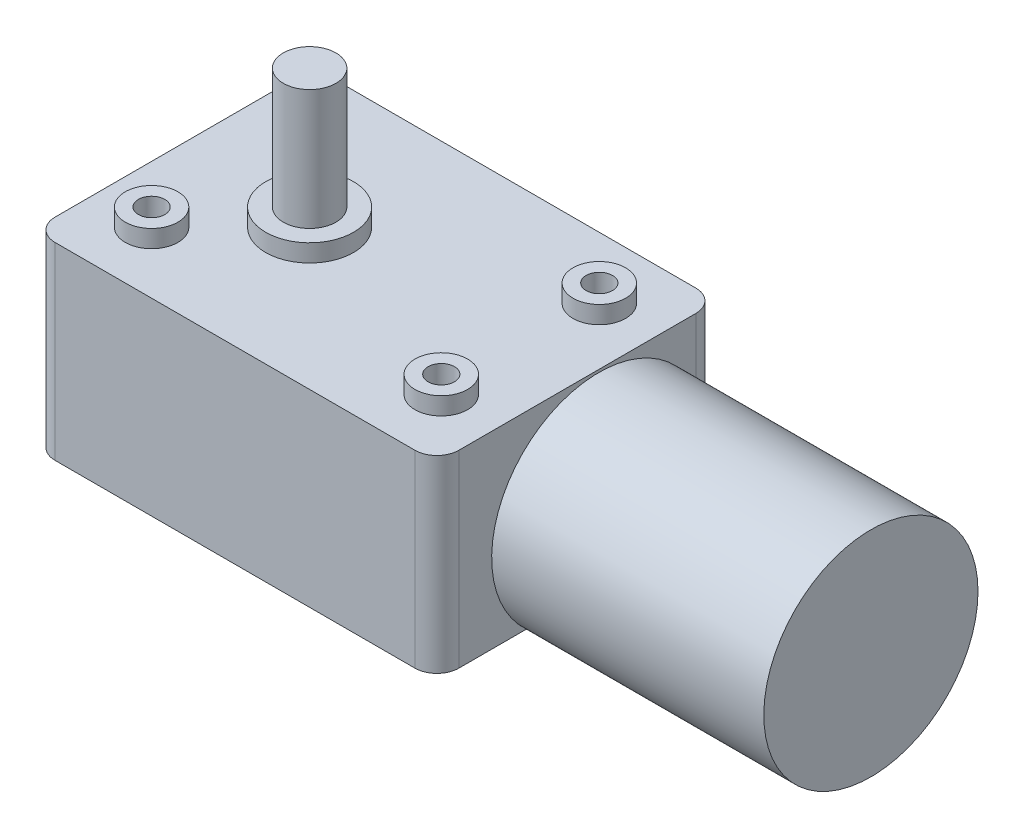
ISO-10303-21;
HEADER;
FILE_DESCRIPTION(('STEP AP214'),'2;1');
FILE_NAME('part.step','',(''),(''),'','','');
FILE_SCHEMA(('AUTOMOTIVE_DESIGN { 1 0 10303 214 1 1 1 1 }'));
ENDSEC;
DATA;
#1=APPLICATION_CONTEXT('core data for automotive mechanical design processes');
#2=APPLICATION_PROTOCOL_DEFINITION('international standard','automotive_design',2000,#1);
#3=PRODUCT_CONTEXT('',#1,'mechanical');
#4=PRODUCT('Part','Part','',(#3));
#5=PRODUCT_RELATED_PRODUCT_CATEGORY('part','',(#4));
#6=PRODUCT_DEFINITION_FORMATION('','',#4);
#7=PRODUCT_DEFINITION_CONTEXT('part definition',#1,'design');
#8=PRODUCT_DEFINITION('design','',#6,#7);
#9=PRODUCT_DEFINITION_SHAPE('','',#8);
#10=(LENGTH_UNIT() NAMED_UNIT(*) SI_UNIT(.MILLI.,.METRE.));
#11=(NAMED_UNIT(*) PLANE_ANGLE_UNIT() SI_UNIT($,.RADIAN.));
#12=(NAMED_UNIT(*) SI_UNIT($,.STERADIAN.) SOLID_ANGLE_UNIT());
#13=UNCERTAINTY_MEASURE_WITH_UNIT(LENGTH_MEASURE(1.E-05),#10,'distance_accuracy_value','');
#14=(GEOMETRIC_REPRESENTATION_CONTEXT(3) GLOBAL_UNCERTAINTY_ASSIGNED_CONTEXT((#13)) GLOBAL_UNIT_ASSIGNED_CONTEXT((#10,
#11,#12)) REPRESENTATION_CONTEXT('',''));
#15=CARTESIAN_POINT('',(0.,0.,0.));
#16=DIRECTION('',(0.,0.,1.));
#17=DIRECTION('',(1.,0.,0.));
#18=AXIS2_PLACEMENT_3D('',#15,#16,#17);
#19=CARTESIAN_POINT('',(23.,10.75,13.5));
#20=DIRECTION('',(-1.,0.,0.));
#21=DIRECTION('',(0.,0.,1.));
#22=AXIS2_PLACEMENT_3D('',#19,#20,#21);
#23=PLANE('',#22);
#24=CARTESIAN_POINT('',(23.,-1.75,-2.43669858620224));
#25=DIRECTION('',(1.,0.,0.));
#26=DIRECTION('',(0.,0.,-1.));
#27=AXIS2_PLACEMENT_3D('',#24,#25,#26);
#28=CIRCLE('',#27,12.2);
#29=CARTESIAN_POINT('',(23.,-10.75,-10.6732026989918));
#30=VERTEX_POINT('',#29);
#31=CARTESIAN_POINT('',(23.,-6.89231094231576,-13.5));
#32=VERTEX_POINT('',#31);
#33=EDGE_CURVE('E124',#30,#32,#28,.T.);
#34=ORIENTED_EDGE('',*,*,#33,.F.);
#35=DIRECTION('',(0.,0.,-1.));
#36=VECTOR('',#35,1.);
#37=CARTESIAN_POINT('',(23.,-10.75,13.5));
#38=LINE('',#37,#36);
#39=CARTESIAN_POINT('',(23.,-10.75,-13.5));
#40=VERTEX_POINT('',#39);
#41=EDGE_CURVE('E112',#30,#40,#38,.T.);
#42=ORIENTED_EDGE('',*,*,#41,.T.);
#43=DIRECTION('',(0.,-1.,0.));
#44=VECTOR('',#43,1.);
#45=CARTESIAN_POINT('',(23.,10.75,-13.5));
#46=LINE('',#45,#44);
#47=EDGE_CURVE('E48',#32,#40,#46,.T.);
#48=ORIENTED_EDGE('',*,*,#47,.F.);
#49=EDGE_LOOP('',(#34,#42,#48));
#50=FACE_BOUND('',#49,.T.);
#51=ADVANCED_FACE('F33',(#50),#23,.F.);
#52=CARTESIAN_POINT('',(23.,3.39231094231576,-13.5));
#53=VERTEX_POINT('',#52);
#54=CARTESIAN_POINT('',(23.,-10.75,5.79980552658736));
#55=VERTEX_POINT('',#54);
#56=EDGE_CURVE('E56',#53,#55,#28,.T.);
#57=ORIENTED_EDGE('',*,*,#56,.F.);
#58=CARTESIAN_POINT('',(23.,10.75,-13.5));
#59=VERTEX_POINT('',#58);
#60=EDGE_CURVE('E242',#59,#53,#46,.T.);
#61=ORIENTED_EDGE('',*,*,#60,.F.);
#62=DIRECTION('',(0.,0.,-1.));
#63=VECTOR('',#62,1.);
#64=CARTESIAN_POINT('',(23.,10.75,13.5));
#65=LINE('',#64,#63);
#66=CARTESIAN_POINT('',(23.,10.75,13.5));
#67=VERTEX_POINT('',#66);
#68=EDGE_CURVE('E209',#67,#59,#65,.T.);
#69=ORIENTED_EDGE('',*,*,#68,.F.);
#70=DIRECTION('',(0.,-1.,0.));
#71=VECTOR('',#70,1.);
#72=CARTESIAN_POINT('',(23.,10.75,13.5));
#73=LINE('',#72,#71);
#74=CARTESIAN_POINT('',(23.,-10.75,13.5));
#75=VERTEX_POINT('',#74);
#76=EDGE_CURVE('E244',#67,#75,#73,.T.);
#77=ORIENTED_EDGE('',*,*,#76,.T.);
#78=EDGE_CURVE('E122',#75,#55,#38,.T.);
#79=ORIENTED_EDGE('',*,*,#78,.T.);
#80=EDGE_LOOP('',(#57,#61,#69,#77,#79));
#81=FACE_BOUND('',#80,.T.);
#82=ADVANCED_FACE('F254',(#81),#23,.F.);
#83=CARTESIAN_POINT('',(-7.49999999999995,12.75,0.));
#84=DIRECTION('',(0.,1.,0.));
#85=DIRECTION('',(0.,0.,1.));
#86=AXIS2_PLACEMENT_3D('',#83,#84,#85);
#87=PLANE('',#86);
#88=CARTESIAN_POINT('',(-7.49999999999995,12.75,0.));
#89=DIRECTION('',(0.,1.,0.));
#90=DIRECTION('',(0.,0.,1.));
#91=AXIS2_PLACEMENT_3D('',#88,#89,#90);
#92=CIRCLE('',#91,5.);
#93=CARTESIAN_POINT('',(-7.49999999999995,12.75,5.));
#94=VERTEX_POINT('',#93);
#95=EDGE_CURVE('E171',#94,#94,#92,.T.);
#96=ORIENTED_EDGE('',*,*,#95,.T.);
#97=EDGE_LOOP('',(#96));
#98=FACE_BOUND('',#97,.T.);
#99=CARTESIAN_POINT('',(-7.49999999999995,12.75,0.));
#100=DIRECTION('',(0.,1.,0.));
#101=DIRECTION('',(0.,0.,1.));
#102=AXIS2_PLACEMENT_3D('',#99,#100,#101);
#103=CIRCLE('',#102,3.);
#104=CARTESIAN_POINT('',(-7.49999999999995,12.75,-3.));
#105=VERTEX_POINT('',#104);
#106=EDGE_CURVE('E140',#105,#105,#103,.T.);
#107=ORIENTED_EDGE('',*,*,#106,.F.);
#108=EDGE_LOOP('',(#107));
#109=FACE_BOUND('',#108,.T.);
#110=ADVANCED_FACE('F301',(#98,#109),#87,.T.);
#111=CARTESIAN_POINT('',(-20.5,10.75,13.5));
#112=DIRECTION('',(0.,1.,0.));
#113=DIRECTION('',(0.,0.,1.));
#114=AXIS2_PLACEMENT_3D('',#111,#112,#113);
#115=PLANE('',#114);
#116=CARTESIAN_POINT('',(16.5000000000039,10.75,-8.99999999999307));
#117=DIRECTION('',(0.,1.,0.));
#118=DIRECTION('',(0.,0.,1.));
#119=AXIS2_PLACEMENT_3D('',#116,#117,#118);
#120=CIRCLE('',#119,3.);
#121=CARTESIAN_POINT('',(16.5000000000039,10.75,-5.99999999999307));
#122=VERTEX_POINT('',#121);
#123=EDGE_CURVE('E174',#122,#122,#120,.T.);
#124=ORIENTED_EDGE('',*,*,#123,.F.);
#125=EDGE_LOOP('',(#124));
#126=FACE_BOUND('',#125,.T.);
#127=CARTESIAN_POINT('',(-16.5000000000039,10.75,8.99999999999307));
#128=DIRECTION('',(0.,1.,0.));
#129=DIRECTION('',(0.,0.,1.));
#130=AXIS2_PLACEMENT_3D('',#127,#128,#129);
#131=CIRCLE('',#130,3.);
#132=CARTESIAN_POINT('',(-16.5000000000039,10.75,11.9999999999931));
#133=VERTEX_POINT('',#132);
#134=EDGE_CURVE('E186',#133,#133,#131,.T.);
#135=ORIENTED_EDGE('',*,*,#134,.F.);
#136=EDGE_LOOP('',(#135));
#137=FACE_BOUND('',#136,.T.);
#138=CARTESIAN_POINT('',(-20.5,10.75,13.5));
#139=DIRECTION('',(0.,1.,0.));
#140=DIRECTION('',(0.,0.,1.));
#141=AXIS2_PLACEMENT_3D('',#138,#139,#140);
#142=CIRCLE('',#141,2.5);
#143=CARTESIAN_POINT('',(-23.,10.75,13.5));
#144=VERTEX_POINT('',#143);
#145=CARTESIAN_POINT('',(-20.5,10.75,16.));
#146=VERTEX_POINT('',#145);
#147=EDGE_CURVE('E201',#144,#146,#142,.T.);
#148=ORIENTED_EDGE('',*,*,#147,.T.);
#149=DIRECTION('',(1.,0.,0.));
#150=VECTOR('',#149,1.);
#151=CARTESIAN_POINT('',(-20.5,10.75,16.));
#152=LINE('',#151,#150);
#153=CARTESIAN_POINT('',(20.5,10.75,16.));
#154=VERTEX_POINT('',#153);
#155=EDGE_CURVE('E204',#146,#154,#152,.T.);
#156=ORIENTED_EDGE('',*,*,#155,.T.);
#157=CARTESIAN_POINT('',(20.5,10.75,13.5));
#158=DIRECTION('',(0.,1.,0.));
#159=DIRECTION('',(0.,0.,1.));
#160=AXIS2_PLACEMENT_3D('',#157,#158,#159);
#161=CIRCLE('',#160,2.5);
#162=EDGE_CURVE('E207',#154,#67,#161,.T.);
#163=ORIENTED_EDGE('',*,*,#162,.T.);
#164=ORIENTED_EDGE('',*,*,#68,.T.);
#165=CARTESIAN_POINT('',(20.5,10.75,-13.5));
#166=DIRECTION('',(0.,1.,0.));
#167=DIRECTION('',(0.,0.,1.));
#168=AXIS2_PLACEMENT_3D('',#165,#166,#167);
#169=CIRCLE('',#168,2.5);
#170=CARTESIAN_POINT('',(20.5,10.75,-16.));
#171=VERTEX_POINT('',#170);
#172=EDGE_CURVE('E211',#59,#171,#169,.T.);
#173=ORIENTED_EDGE('',*,*,#172,.T.);
#174=DIRECTION('',(-1.,0.,0.));
#175=VECTOR('',#174,1.);
#176=CARTESIAN_POINT('',(-20.5,10.75,-16.));
#177=LINE('',#176,#175);
#178=CARTESIAN_POINT('',(-20.5,10.75,-16.));
#179=VERTEX_POINT('',#178);
#180=EDGE_CURVE('E213',#171,#179,#177,.T.);
#181=ORIENTED_EDGE('',*,*,#180,.T.);
#182=CARTESIAN_POINT('',(-20.5,10.75,-13.5));
#183=DIRECTION('',(0.,1.,0.));
#184=DIRECTION('',(0.,0.,-1.));
#185=AXIS2_PLACEMENT_3D('',#182,#183,#184);
#186=CIRCLE('',#185,2.5);
#187=CARTESIAN_POINT('',(-23.,10.75,-13.5));
#188=VERTEX_POINT('',#187);
#189=EDGE_CURVE('E215',#179,#188,#186,.T.);
#190=ORIENTED_EDGE('',*,*,#189,.T.);
#191=DIRECTION('',(0.,0.,1.));
#192=VECTOR('',#191,1.);
#193=CARTESIAN_POINT('',(-23.,10.75,13.5));
#194=LINE('',#193,#192);
#195=EDGE_CURVE('E217',#188,#144,#194,.T.);
#196=ORIENTED_EDGE('',*,*,#195,.T.);
#197=EDGE_LOOP('',(#148,#156,#163,#164,#173,#181,#190,#196));
#198=FACE_BOUND('',#197,.T.);
#199=CARTESIAN_POINT('',(-16.5000000000039,10.75,-8.99999999999307));
#200=DIRECTION('',(0.,1.,0.));
#201=DIRECTION('',(0.,0.,1.));
#202=AXIS2_PLACEMENT_3D('',#199,#200,#201);
#203=CIRCLE('',#202,3.);
#204=CARTESIAN_POINT('',(-16.5000000000039,10.75,-5.99999999999307));
#205=VERTEX_POINT('',#204);
#206=EDGE_CURVE('E192',#205,#205,#203,.T.);
#207=ORIENTED_EDGE('',*,*,#206,.F.);
#208=EDGE_LOOP('',(#207));
#209=FACE_BOUND('',#208,.T.);
#210=CARTESIAN_POINT('',(16.5,10.75,9.00000000000001));
#211=DIRECTION('',(0.,1.,0.));
#212=DIRECTION('',(0.,0.,1.));
#213=AXIS2_PLACEMENT_3D('',#210,#211,#212);
#214=CIRCLE('',#213,3.);
#215=CARTESIAN_POINT('',(16.5,10.75,12.));
#216=VERTEX_POINT('',#215);
#217=EDGE_CURVE('E180',#216,#216,#214,.T.);
#218=ORIENTED_EDGE('',*,*,#217,.F.);
#219=EDGE_LOOP('',(#218));
#220=FACE_BOUND('',#219,.T.);
#221=CARTESIAN_POINT('',(-7.49999999999995,10.75,0.));
#222=DIRECTION('',(0.,1.,0.));
#223=DIRECTION('',(0.,0.,1.));
#224=AXIS2_PLACEMENT_3D('',#221,#222,#223);
#225=CIRCLE('',#224,5.);
#226=CARTESIAN_POINT('',(-7.49999999999995,10.75,5.));
#227=VERTEX_POINT('',#226);
#228=EDGE_CURVE('E168',#227,#227,#225,.T.);
#229=ORIENTED_EDGE('',*,*,#228,.F.);
#230=EDGE_LOOP('',(#229));
#231=FACE_BOUND('',#230,.T.);
#232=ADVANCED_FACE('F258',(#126,#137,#198,#209,#220,#231),#115,.T.);
#233=CARTESIAN_POINT('',(-20.5,10.75,13.5));
#234=DIRECTION('',(0.,-1.,0.));
#235=DIRECTION('',(0.,0.,-1.));
#236=AXIS2_PLACEMENT_3D('',#233,#234,#235);
#237=CYLINDRICAL_SURFACE('',#236,2.5);
#238=CARTESIAN_POINT('',(-20.5,-10.75,13.5));
#239=DIRECTION('',(0.,1.,0.));
#240=DIRECTION('',(0.,0.,1.));
#241=AXIS2_PLACEMENT_3D('',#238,#239,#240);
#242=CIRCLE('',#241,2.5);
#243=CARTESIAN_POINT('',(-23.,-10.75,13.5));
#244=VERTEX_POINT('',#243);
#245=CARTESIAN_POINT('',(-20.5,-10.75,16.));
#246=VERTEX_POINT('',#245);
#247=EDGE_CURVE('E198',#244,#246,#242,.T.);
#248=ORIENTED_EDGE('',*,*,#247,.T.);
#249=DIRECTION('',(0.,-1.,0.));
#250=VECTOR('',#249,1.);
#251=CARTESIAN_POINT('',(-20.5,10.75,16.));
#252=LINE('',#251,#250);
#253=EDGE_CURVE('E11',#146,#246,#252,.T.);
#254=ORIENTED_EDGE('',*,*,#253,.F.);
#255=ORIENTED_EDGE('',*,*,#147,.F.);
#256=DIRECTION('',(0.,-1.,0.));
#257=VECTOR('',#256,1.);
#258=CARTESIAN_POINT('',(-23.,10.75,13.5));
#259=LINE('',#258,#257);
#260=EDGE_CURVE('E219',#144,#244,#259,.T.);
#261=ORIENTED_EDGE('',*,*,#260,.T.);
#262=EDGE_LOOP('',(#248,#254,#255,#261));
#263=FACE_BOUND('',#262,.T.);
#264=ADVANCED_FACE('F35',(#263),#237,.T.);
#265=CARTESIAN_POINT('',(-20.5,10.75,16.));
#266=DIRECTION('',(0.,0.,-1.));
#267=DIRECTION('',(-1.,0.,0.));
#268=AXIS2_PLACEMENT_3D('',#265,#266,#267);
#269=PLANE('',#268);
#270=DIRECTION('',(1.,0.,0.));
#271=VECTOR('',#270,1.);
#272=CARTESIAN_POINT('',(-20.5,-10.75,16.));
#273=LINE('',#272,#271);
#274=CARTESIAN_POINT('',(20.5,-10.75,16.));
#275=VERTEX_POINT('',#274);
#276=EDGE_CURVE('E222',#246,#275,#273,.T.);
#277=ORIENTED_EDGE('',*,*,#276,.T.);
#278=DIRECTION('',(0.,-1.,0.));
#279=VECTOR('',#278,1.);
#280=CARTESIAN_POINT('',(20.5,10.75,16.));
#281=LINE('',#280,#279);
#282=EDGE_CURVE('E41',#154,#275,#281,.T.);
#283=ORIENTED_EDGE('',*,*,#282,.F.);
#284=ORIENTED_EDGE('',*,*,#155,.F.);
#285=ORIENTED_EDGE('',*,*,#253,.T.);
#286=EDGE_LOOP('',(#277,#283,#284,#285));
#287=FACE_BOUND('',#286,.T.);
#288=ADVANCED_FACE('F263',(#287),#269,.F.);
#289=CARTESIAN_POINT('',(20.5,10.75,13.5));
#290=DIRECTION('',(0.,-1.,0.));
#291=DIRECTION('',(0.,0.,-1.));
#292=AXIS2_PLACEMENT_3D('',#289,#290,#291);
#293=CYLINDRICAL_SURFACE('',#292,2.5);
#294=CARTESIAN_POINT('',(20.5,-10.75,13.5));
#295=DIRECTION('',(0.,1.,0.));
#296=DIRECTION('',(0.,0.,1.));
#297=AXIS2_PLACEMENT_3D('',#294,#295,#296);
#298=CIRCLE('',#297,2.5);
#299=EDGE_CURVE('E120',#275,#75,#298,.T.);
#300=ORIENTED_EDGE('',*,*,#299,.T.);
#301=ORIENTED_EDGE('',*,*,#76,.F.);
#302=ORIENTED_EDGE('',*,*,#162,.F.);
#303=ORIENTED_EDGE('',*,*,#282,.T.);
#304=EDGE_LOOP('',(#300,#301,#302,#303));
#305=FACE_BOUND('',#304,.T.);
#306=ADVANCED_FACE('F251',(#305),#293,.T.);
#307=CARTESIAN_POINT('',(20.5,10.75,-13.5));
#308=DIRECTION('',(0.,-1.,0.));
#309=DIRECTION('',(0.,0.,-1.));
#310=AXIS2_PLACEMENT_3D('',#307,#308,#309);
#311=CYLINDRICAL_SURFACE('',#310,2.5);
#312=CARTESIAN_POINT('',(20.5,-10.75,-13.5));
#313=DIRECTION('',(0.,1.,0.));
#314=DIRECTION('',(0.,0.,1.));
#315=AXIS2_PLACEMENT_3D('',#312,#313,#314);
#316=CIRCLE('',#315,2.5);
#317=CARTESIAN_POINT('',(20.5,-10.75,-16.));
#318=VERTEX_POINT('',#317);
#319=EDGE_CURVE('E119',#40,#318,#316,.T.);
#320=ORIENTED_EDGE('',*,*,#319,.T.);
#321=DIRECTION('',(0.,-1.,0.));
#322=VECTOR('',#321,1.);
#323=CARTESIAN_POINT('',(20.5,10.75,-16.));
#324=LINE('',#323,#322);
#325=EDGE_CURVE('E239',#171,#318,#324,.T.);
#326=ORIENTED_EDGE('',*,*,#325,.F.);
#327=ORIENTED_EDGE('',*,*,#172,.F.);
#328=ORIENTED_EDGE('',*,*,#60,.T.);
#329=DIRECTION('',(0.,-1.,0.));
#330=VECTOR('',#329,1.);
#331=CARTESIAN_POINT('',(23.,10.75,-13.5));
#332=LINE('',#331,#330);
#333=EDGE_CURVE('E138',#53,#32,#332,.T.);
#334=ORIENTED_EDGE('',*,*,#333,.T.);
#335=ORIENTED_EDGE('',*,*,#47,.T.);
#336=EDGE_LOOP('',(#320,#326,#327,#328,#334,#335));
#337=FACE_BOUND('',#336,.T.);
#338=ADVANCED_FACE('F280',(#337),#311,.T.);
#339=CARTESIAN_POINT('',(-20.5,10.75,-16.));
#340=DIRECTION('',(0.,0.,1.));
#341=DIRECTION('',(1.,0.,0.));
#342=AXIS2_PLACEMENT_3D('',#339,#340,#341);
#343=PLANE('',#342);
#344=DIRECTION('',(-1.,0.,0.));
#345=VECTOR('',#344,1.);
#346=CARTESIAN_POINT('',(-20.5,-10.75,-16.));
#347=LINE('',#346,#345);
#348=CARTESIAN_POINT('',(-20.5,-10.75,-16.));
#349=VERTEX_POINT('',#348);
#350=EDGE_CURVE('E226',#318,#349,#347,.T.);
#351=ORIENTED_EDGE('',*,*,#350,.T.);
#352=DIRECTION('',(0.,-1.,0.));
#353=VECTOR('',#352,1.);
#354=CARTESIAN_POINT('',(-20.5,10.75,-16.));
#355=LINE('',#354,#353);
#356=EDGE_CURVE('E236',#179,#349,#355,.T.);
#357=ORIENTED_EDGE('',*,*,#356,.F.);
#358=ORIENTED_EDGE('',*,*,#180,.F.);
#359=ORIENTED_EDGE('',*,*,#325,.T.);
#360=EDGE_LOOP('',(#351,#357,#358,#359));
#361=FACE_BOUND('',#360,.T.);
#362=ADVANCED_FACE('F278',(#361),#343,.F.);
#363=CARTESIAN_POINT('',(-20.5,10.75,-13.5));
#364=DIRECTION('',(0.,-1.,0.));
#365=DIRECTION('',(0.,0.,-1.));
#366=AXIS2_PLACEMENT_3D('',#363,#364,#365);
#367=CYLINDRICAL_SURFACE('',#366,2.5);
#368=CARTESIAN_POINT('',(-20.5,-10.75,-13.5));
#369=DIRECTION('',(0.,1.,0.));
#370=DIRECTION('',(0.,0.,-1.));
#371=AXIS2_PLACEMENT_3D('',#368,#369,#370);
#372=CIRCLE('',#371,2.5);
#373=CARTESIAN_POINT('',(-23.,-10.75,-13.5));
#374=VERTEX_POINT('',#373);
#375=EDGE_CURVE('E228',#349,#374,#372,.T.);
#376=ORIENTED_EDGE('',*,*,#375,.T.);
#377=DIRECTION('',(0.,-1.,0.));
#378=VECTOR('',#377,1.);
#379=CARTESIAN_POINT('',(-23.,10.75,-13.5));
#380=LINE('',#379,#378);
#381=EDGE_CURVE('E233',#188,#374,#380,.T.);
#382=ORIENTED_EDGE('',*,*,#381,.F.);
#383=ORIENTED_EDGE('',*,*,#189,.F.);
#384=ORIENTED_EDGE('',*,*,#356,.T.);
#385=EDGE_LOOP('',(#376,#382,#383,#384));
#386=FACE_BOUND('',#385,.T.);
#387=ADVANCED_FACE('F274',(#386),#367,.T.);
#388=CARTESIAN_POINT('',(-23.,10.75,13.5));
#389=DIRECTION('',(1.,0.,0.));
#390=DIRECTION('',(0.,0.,-1.));
#391=AXIS2_PLACEMENT_3D('',#388,#389,#390);
#392=PLANE('',#391);
#393=DIRECTION('',(0.,0.,1.));
#394=VECTOR('',#393,1.);
#395=CARTESIAN_POINT('',(-23.,-10.75,13.5));
#396=LINE('',#395,#394);
#397=EDGE_CURVE('E205',#374,#244,#396,.T.);
#398=ORIENTED_EDGE('',*,*,#397,.T.);
#399=ORIENTED_EDGE('',*,*,#260,.F.);
#400=ORIENTED_EDGE('',*,*,#195,.F.);
#401=ORIENTED_EDGE('',*,*,#381,.T.);
#402=EDGE_LOOP('',(#398,#399,#400,#401));
#403=FACE_BOUND('',#402,.T.);
#404=ADVANCED_FACE('F269',(#403),#392,.F.);
#405=CARTESIAN_POINT('',(-20.5,-10.75,13.5));
#406=DIRECTION('',(0.,1.,0.));
#407=DIRECTION('',(0.,0.,1.));
#408=AXIS2_PLACEMENT_3D('',#405,#406,#407);
#409=PLANE('',#408);
#410=ORIENTED_EDGE('',*,*,#247,.F.);
#411=ORIENTED_EDGE('',*,*,#397,.F.);
#412=ORIENTED_EDGE('',*,*,#375,.F.);
#413=ORIENTED_EDGE('',*,*,#350,.F.);
#414=ORIENTED_EDGE('',*,*,#319,.F.);
#415=ORIENTED_EDGE('',*,*,#41,.F.);
#416=EDGE_CURVE('E117',#55,#30,#38,.T.);
#417=ORIENTED_EDGE('',*,*,#416,.F.);
#418=ORIENTED_EDGE('',*,*,#78,.F.);
#419=ORIENTED_EDGE('',*,*,#299,.F.);
#420=ORIENTED_EDGE('',*,*,#276,.F.);
#421=EDGE_LOOP('',(#410,#411,#412,#413,#414,#415,#417,#418,#419,#420));
#422=FACE_BOUND('',#421,.T.);
#423=ADVANCED_FACE('F114',(#422),#409,.F.);
#424=CARTESIAN_POINT('',(-16.5000000000039,12.75,-8.99999999999307));
#425=DIRECTION('',(0.,-1.,0.));
#426=DIRECTION('',(0.,0.,-1.));
#427=AXIS2_PLACEMENT_3D('',#424,#425,#426);
#428=CYLINDRICAL_SURFACE('',#427,3.);
#429=CARTESIAN_POINT('',(-16.5000000000039,12.75,-8.99999999999307));
#430=DIRECTION('',(0.,1.,0.));
#431=DIRECTION('',(0.,0.,1.));
#432=AXIS2_PLACEMENT_3D('',#429,#430,#431);
#433=CIRCLE('',#432,3.);
#434=CARTESIAN_POINT('',(-16.5000000000039,12.75,-5.99999999999307));
#435=VERTEX_POINT('',#434);
#436=EDGE_CURVE('E195',#435,#435,#433,.T.);
#437=ORIENTED_EDGE('',*,*,#436,.F.);
#438=EDGE_LOOP('',(#437));
#439=FACE_BOUND('',#438,.T.);
#440=ORIENTED_EDGE('',*,*,#206,.T.);
#441=EDGE_LOOP('',(#440));
#442=FACE_BOUND('',#441,.T.);
#443=ADVANCED_FACE('F324',(#439,#442),#428,.T.);
#444=CARTESIAN_POINT('',(-16.5000000000039,12.75,-8.99999999999307));
#445=DIRECTION('',(0.,1.,0.));
#446=DIRECTION('',(0.,0.,1.));
#447=AXIS2_PLACEMENT_3D('',#444,#445,#446);
#448=PLANE('',#447);
#449=CARTESIAN_POINT('',(-16.5000000000039,12.75,-8.99999999999307));
#450=DIRECTION('',(0.,1.,0.));
#451=DIRECTION('',(0.,0.,1.));
#452=AXIS2_PLACEMENT_3D('',#449,#450,#451);
#453=CIRCLE('',#452,1.5);
#454=CARTESIAN_POINT('',(-16.5000000000039,12.75,-7.49999999999307));
#455=VERTEX_POINT('',#454);
#456=EDGE_CURVE('E162',#455,#455,#453,.T.);
#457=ORIENTED_EDGE('',*,*,#456,.F.);
#458=EDGE_LOOP('',(#457));
#459=FACE_BOUND('',#458,.T.);
#460=ORIENTED_EDGE('',*,*,#436,.T.);
#461=EDGE_LOOP('',(#460));
#462=FACE_BOUND('',#461,.T.);
#463=ADVANCED_FACE('F375',(#459,#462),#448,.T.);
#464=CARTESIAN_POINT('',(-16.5000000000039,12.75,8.99999999999307));
#465=DIRECTION('',(0.,-1.,0.));
#466=DIRECTION('',(0.,0.,-1.));
#467=AXIS2_PLACEMENT_3D('',#464,#465,#466);
#468=CYLINDRICAL_SURFACE('',#467,3.);
#469=CARTESIAN_POINT('',(-16.5000000000039,12.75,8.99999999999307));
#470=DIRECTION('',(0.,1.,0.));
#471=DIRECTION('',(0.,0.,1.));
#472=AXIS2_PLACEMENT_3D('',#469,#470,#471);
#473=CIRCLE('',#472,3.);
#474=CARTESIAN_POINT('',(-16.5000000000039,12.75,11.9999999999931));
#475=VERTEX_POINT('',#474);
#476=EDGE_CURVE('E189',#475,#475,#473,.T.);
#477=ORIENTED_EDGE('',*,*,#476,.F.);
#478=EDGE_LOOP('',(#477));
#479=FACE_BOUND('',#478,.T.);
#480=ORIENTED_EDGE('',*,*,#134,.T.);
#481=EDGE_LOOP('',(#480));
#482=FACE_BOUND('',#481,.T.);
#483=ADVANCED_FACE('F382',(#479,#482),#468,.T.);
#484=CARTESIAN_POINT('',(-16.5000000000039,12.75,8.99999999999307));
#485=DIRECTION('',(0.,1.,0.));
#486=DIRECTION('',(0.,0.,1.));
#487=AXIS2_PLACEMENT_3D('',#484,#485,#486);
#488=PLANE('',#487);
#489=CARTESIAN_POINT('',(-16.5000000000039,12.75,8.99999999999307));
#490=DIRECTION('',(0.,1.,0.));
#491=DIRECTION('',(0.,0.,1.));
#492=AXIS2_PLACEMENT_3D('',#489,#490,#491);
#493=CIRCLE('',#492,1.5);
#494=CARTESIAN_POINT('',(-16.5000000000039,12.75,10.4999999999931));
#495=VERTEX_POINT('',#494);
#496=EDGE_CURVE('E144',#495,#495,#493,.T.);
#497=ORIENTED_EDGE('',*,*,#496,.F.);
#498=EDGE_LOOP('',(#497));
#499=FACE_BOUND('',#498,.T.);
#500=ORIENTED_EDGE('',*,*,#476,.T.);
#501=EDGE_LOOP('',(#500));
#502=FACE_BOUND('',#501,.T.);
#503=ADVANCED_FACE('F387',(#499,#502),#488,.T.);
#504=CARTESIAN_POINT('',(16.5,12.75,9.00000000000001));
#505=DIRECTION('',(0.,-1.,0.));
#506=DIRECTION('',(0.,0.,-1.));
#507=AXIS2_PLACEMENT_3D('',#504,#505,#506);
#508=CYLINDRICAL_SURFACE('',#507,3.);
#509=CARTESIAN_POINT('',(16.5,12.75,9.00000000000001));
#510=DIRECTION('',(0.,1.,0.));
#511=DIRECTION('',(0.,0.,1.));
#512=AXIS2_PLACEMENT_3D('',#509,#510,#511);
#513=CIRCLE('',#512,3.);
#514=CARTESIAN_POINT('',(16.5,12.75,12.));
#515=VERTEX_POINT('',#514);
#516=EDGE_CURVE('E183',#515,#515,#513,.T.);
#517=ORIENTED_EDGE('',*,*,#516,.F.);
#518=EDGE_LOOP('',(#517));
#519=FACE_BOUND('',#518,.T.);
#520=ORIENTED_EDGE('',*,*,#217,.T.);
#521=EDGE_LOOP('',(#520));
#522=FACE_BOUND('',#521,.T.);
#523=ADVANCED_FACE('F395',(#519,#522),#508,.T.);
#524=CARTESIAN_POINT('',(16.5,12.75,9.00000000000001));
#525=DIRECTION('',(0.,1.,0.));
#526=DIRECTION('',(0.,0.,1.));
#527=AXIS2_PLACEMENT_3D('',#524,#525,#526);
#528=PLANE('',#527);
#529=CARTESIAN_POINT('',(16.5,12.75,9.00000000000001));
#530=DIRECTION('',(0.,1.,0.));
#531=DIRECTION('',(0.,0.,1.));
#532=AXIS2_PLACEMENT_3D('',#529,#530,#531);
#533=CIRCLE('',#532,1.5);
#534=CARTESIAN_POINT('',(16.5,12.75,10.5));
#535=VERTEX_POINT('',#534);
#536=EDGE_CURVE('E150',#535,#535,#533,.T.);
#537=ORIENTED_EDGE('',*,*,#536,.F.);
#538=EDGE_LOOP('',(#537));
#539=FACE_BOUND('',#538,.T.);
#540=ORIENTED_EDGE('',*,*,#516,.T.);
#541=EDGE_LOOP('',(#540));
#542=FACE_BOUND('',#541,.T.);
#543=ADVANCED_FACE('F400',(#539,#542),#528,.T.);
#544=CARTESIAN_POINT('',(16.5000000000039,12.75,-8.99999999999307));
#545=DIRECTION('',(0.,-1.,0.));
#546=DIRECTION('',(0.,0.,-1.));
#547=AXIS2_PLACEMENT_3D('',#544,#545,#546);
#548=CYLINDRICAL_SURFACE('',#547,3.);
#549=CARTESIAN_POINT('',(16.5000000000039,12.75,-8.99999999999307));
#550=DIRECTION('',(0.,1.,0.));
#551=DIRECTION('',(0.,0.,1.));
#552=AXIS2_PLACEMENT_3D('',#549,#550,#551);
#553=CIRCLE('',#552,3.);
#554=CARTESIAN_POINT('',(16.5000000000039,12.75,-5.99999999999307));
#555=VERTEX_POINT('',#554);
#556=EDGE_CURVE('E177',#555,#555,#553,.T.);
#557=ORIENTED_EDGE('',*,*,#556,.F.);
#558=EDGE_LOOP('',(#557));
#559=FACE_BOUND('',#558,.T.);
#560=ORIENTED_EDGE('',*,*,#123,.T.);
#561=EDGE_LOOP('',(#560));
#562=FACE_BOUND('',#561,.T.);
#563=ADVANCED_FACE('F408',(#559,#562),#548,.T.);
#564=CARTESIAN_POINT('',(16.5000000000039,12.75,-8.99999999999307));
#565=DIRECTION('',(0.,1.,0.));
#566=DIRECTION('',(0.,0.,1.));
#567=AXIS2_PLACEMENT_3D('',#564,#565,#566);
#568=PLANE('',#567);
#569=CARTESIAN_POINT('',(16.5000000000039,12.75,-8.99999999999307));
#570=DIRECTION('',(0.,1.,0.));
#571=DIRECTION('',(0.,0.,1.));
#572=AXIS2_PLACEMENT_3D('',#569,#570,#571);
#573=CIRCLE('',#572,1.5);
#574=CARTESIAN_POINT('',(16.5000000000039,12.75,-7.49999999999306));
#575=VERTEX_POINT('',#574);
#576=EDGE_CURVE('E156',#575,#575,#573,.T.);
#577=ORIENTED_EDGE('',*,*,#576,.F.);
#578=EDGE_LOOP('',(#577));
#579=FACE_BOUND('',#578,.T.);
#580=ORIENTED_EDGE('',*,*,#556,.T.);
#581=EDGE_LOOP('',(#580));
#582=FACE_BOUND('',#581,.T.);
#583=ADVANCED_FACE('F413',(#579,#582),#568,.T.);
#584=CARTESIAN_POINT('',(-7.49999999999995,12.75,0.));
#585=DIRECTION('',(0.,-1.,0.));
#586=DIRECTION('',(0.,0.,-1.));
#587=AXIS2_PLACEMENT_3D('',#584,#585,#586);
#588=CYLINDRICAL_SURFACE('',#587,5.);
#589=ORIENTED_EDGE('',*,*,#95,.F.);
#590=EDGE_LOOP('',(#589));
#591=FACE_BOUND('',#590,.T.);
#592=ORIENTED_EDGE('',*,*,#228,.T.);
#593=EDGE_LOOP('',(#592));
#594=FACE_BOUND('',#593,.T.);
#595=ADVANCED_FACE('F421',(#591,#594),#588,.T.);
#596=CARTESIAN_POINT('',(-16.5000000000039,6.75,-8.99999999999307));
#597=DIRECTION('',(0.,1.,0.));
#598=DIRECTION('',(0.,0.,1.));
#599=AXIS2_PLACEMENT_3D('',#596,#597,#598);
#600=CYLINDRICAL_SURFACE('',#599,1.5);
#601=CARTESIAN_POINT('',(-16.5000000000039,6.75,-8.99999999999307));
#602=DIRECTION('',(0.,1.,0.));
#603=DIRECTION('',(0.,0.,1.));
#604=AXIS2_PLACEMENT_3D('',#601,#602,#603);
#605=CIRCLE('',#604,1.5);
#606=CARTESIAN_POINT('',(-16.5000000000039,6.75,-7.49999999999307));
#607=VERTEX_POINT('',#606);
#608=EDGE_CURVE('E165',#607,#607,#605,.T.);
#609=ORIENTED_EDGE('',*,*,#608,.F.);
#610=EDGE_LOOP('',(#609));
#611=FACE_BOUND('',#610,.T.);
#612=ORIENTED_EDGE('',*,*,#456,.T.);
#613=EDGE_LOOP('',(#612));
#614=FACE_BOUND('',#613,.T.);
#615=ADVANCED_FACE('F426',(#611,#614),#600,.F.);
#616=CARTESIAN_POINT('',(-16.5000000000039,6.75,-8.99999999999307));
#617=DIRECTION('',(0.,1.,0.));
#618=DIRECTION('',(0.,0.,1.));
#619=AXIS2_PLACEMENT_3D('',#616,#617,#618);
#620=PLANE('',#619);
#621=ORIENTED_EDGE('',*,*,#608,.T.);
#622=EDGE_LOOP('',(#621));
#623=FACE_BOUND('',#622,.T.);
#624=ADVANCED_FACE('F463',(#623),#620,.T.);
#625=CARTESIAN_POINT('',(16.5000000000039,6.75,-8.99999999999307));
#626=DIRECTION('',(0.,1.,0.));
#627=DIRECTION('',(0.,0.,1.));
#628=AXIS2_PLACEMENT_3D('',#625,#626,#627);
#629=CYLINDRICAL_SURFACE('',#628,1.5);
#630=CARTESIAN_POINT('',(16.5000000000039,6.75,-8.99999999999307));
#631=DIRECTION('',(0.,1.,0.));
#632=DIRECTION('',(0.,0.,1.));
#633=AXIS2_PLACEMENT_3D('',#630,#631,#632);
#634=CIRCLE('',#633,1.5);
#635=CARTESIAN_POINT('',(16.5000000000039,6.75,-7.49999999999306));
#636=VERTEX_POINT('',#635);
#637=EDGE_CURVE('E159',#636,#636,#634,.T.);
#638=ORIENTED_EDGE('',*,*,#637,.F.);
#639=EDGE_LOOP('',(#638));
#640=FACE_BOUND('',#639,.T.);
#641=ORIENTED_EDGE('',*,*,#576,.T.);
#642=EDGE_LOOP('',(#641));
#643=FACE_BOUND('',#642,.T.);
#644=ADVANCED_FACE('F473',(#640,#643),#629,.F.);
#645=CARTESIAN_POINT('',(16.5000000000039,6.75,-8.99999999999307));
#646=DIRECTION('',(0.,1.,0.));
#647=DIRECTION('',(0.,0.,1.));
#648=AXIS2_PLACEMENT_3D('',#645,#646,#647);
#649=PLANE('',#648);
#650=ORIENTED_EDGE('',*,*,#637,.T.);
#651=EDGE_LOOP('',(#650));
#652=FACE_BOUND('',#651,.T.);
#653=ADVANCED_FACE('F483',(#652),#649,.T.);
#654=CARTESIAN_POINT('',(16.5,6.75,9.00000000000001));
#655=DIRECTION('',(0.,1.,0.));
#656=DIRECTION('',(0.,0.,1.));
#657=AXIS2_PLACEMENT_3D('',#654,#655,#656);
#658=CYLINDRICAL_SURFACE('',#657,1.5);
#659=CARTESIAN_POINT('',(16.5,6.75,9.00000000000001));
#660=DIRECTION('',(0.,1.,0.));
#661=DIRECTION('',(0.,0.,1.));
#662=AXIS2_PLACEMENT_3D('',#659,#660,#661);
#663=CIRCLE('',#662,1.5);
#664=CARTESIAN_POINT('',(16.5,6.75,10.5));
#665=VERTEX_POINT('',#664);
#666=EDGE_CURVE('E153',#665,#665,#663,.T.);
#667=ORIENTED_EDGE('',*,*,#666,.F.);
#668=EDGE_LOOP('',(#667));
#669=FACE_BOUND('',#668,.T.);
#670=ORIENTED_EDGE('',*,*,#536,.T.);
#671=EDGE_LOOP('',(#670));
#672=FACE_BOUND('',#671,.T.);
#673=ADVANCED_FACE('F493',(#669,#672),#658,.F.);
#674=CARTESIAN_POINT('',(16.5,6.75,9.00000000000001));
#675=DIRECTION('',(0.,1.,0.));
#676=DIRECTION('',(0.,0.,1.));
#677=AXIS2_PLACEMENT_3D('',#674,#675,#676);
#678=PLANE('',#677);
#679=ORIENTED_EDGE('',*,*,#666,.T.);
#680=EDGE_LOOP('',(#679));
#681=FACE_BOUND('',#680,.T.);
#682=ADVANCED_FACE('F503',(#681),#678,.T.);
#683=CARTESIAN_POINT('',(-16.5000000000039,6.75,8.99999999999307));
#684=DIRECTION('',(0.,1.,0.));
#685=DIRECTION('',(0.,0.,1.));
#686=AXIS2_PLACEMENT_3D('',#683,#684,#685);
#687=CYLINDRICAL_SURFACE('',#686,1.5);
#688=CARTESIAN_POINT('',(-16.5000000000039,6.75,8.99999999999307));
#689=DIRECTION('',(0.,1.,0.));
#690=DIRECTION('',(0.,0.,1.));
#691=AXIS2_PLACEMENT_3D('',#688,#689,#690);
#692=CIRCLE('',#691,1.5);
#693=CARTESIAN_POINT('',(-16.5000000000039,6.75,10.4999999999931));
#694=VERTEX_POINT('',#693);
#695=EDGE_CURVE('E147',#694,#694,#692,.T.);
#696=ORIENTED_EDGE('',*,*,#695,.F.);
#697=EDGE_LOOP('',(#696));
#698=FACE_BOUND('',#697,.T.);
#699=ORIENTED_EDGE('',*,*,#496,.T.);
#700=EDGE_LOOP('',(#699));
#701=FACE_BOUND('',#700,.T.);
#702=ADVANCED_FACE('F513',(#698,#701),#687,.F.);
#703=CARTESIAN_POINT('',(-16.5000000000039,6.75,8.99999999999307));
#704=DIRECTION('',(0.,1.,0.));
#705=DIRECTION('',(0.,0.,1.));
#706=AXIS2_PLACEMENT_3D('',#703,#704,#705);
#707=PLANE('',#706);
#708=ORIENTED_EDGE('',*,*,#695,.T.);
#709=EDGE_LOOP('',(#708));
#710=FACE_BOUND('',#709,.T.);
#711=ADVANCED_FACE('F523',(#710),#707,.T.);
#712=CARTESIAN_POINT('',(-7.49999999999995,26.45,0.));
#713=DIRECTION('',(0.,-1.,0.));
#714=DIRECTION('',(0.,0.,-1.));
#715=AXIS2_PLACEMENT_3D('',#712,#713,#714);
#716=CYLINDRICAL_SURFACE('',#715,3.);
#717=CARTESIAN_POINT('',(-7.49999999999995,26.45,0.));
#718=DIRECTION('',(0.,1.,0.));
#719=DIRECTION('',(0.,0.,1.));
#720=AXIS2_PLACEMENT_3D('',#717,#718,#719);
#721=CIRCLE('',#720,3.);
#722=CARTESIAN_POINT('',(-7.49999999999995,26.45,-3.));
#723=VERTEX_POINT('',#722);
#724=EDGE_CURVE('E141',#723,#723,#721,.T.);
#725=CARTESIAN_POINT('',(-7.49999999999995,26.45,-3.));
#726=CARTESIAN_POINT('',(-7.49999999999995,26.3072916666667,-3.));
#727=CARTESIAN_POINT('',(-7.49999999999995,26.1645833333333,-3.));
#728=CARTESIAN_POINT('',(-7.49999999999995,25.8791666666667,-3.));
#729=CARTESIAN_POINT('',(-7.49999999999995,25.7364583333333,-3.));
#730=CARTESIAN_POINT('',(-7.49999999999995,25.4510416666667,-3.));
#731=CARTESIAN_POINT('',(-7.49999999999995,25.3083333333333,-3.));
#732=CARTESIAN_POINT('',(-7.49999999999995,25.0229166666667,-3.));
#733=CARTESIAN_POINT('',(-7.49999999999995,24.8802083333333,-3.));
#734=CARTESIAN_POINT('',(-7.49999999999995,24.5947916666667,-3.));
#735=CARTESIAN_POINT('',(-7.49999999999995,24.4520833333333,-3.));
#736=CARTESIAN_POINT('',(-7.49999999999995,24.1666666666667,-3.));
#737=CARTESIAN_POINT('',(-7.49999999999995,24.0239583333333,-3.));
#738=CARTESIAN_POINT('',(-7.49999999999995,23.7385416666667,-3.));
#739=CARTESIAN_POINT('',(-7.49999999999995,23.5958333333333,-3.));
#740=CARTESIAN_POINT('',(-7.49999999999995,23.3104166666667,-3.));
#741=CARTESIAN_POINT('',(-7.49999999999995,23.1677083333333,-3.));
#742=CARTESIAN_POINT('',(-7.49999999999995,22.8822916666667,-3.));
#743=CARTESIAN_POINT('',(-7.49999999999995,22.7395833333333,-3.));
#744=CARTESIAN_POINT('',(-7.49999999999995,22.4541666666667,-3.));
#745=CARTESIAN_POINT('',(-7.49999999999995,22.3114583333333,-3.));
#746=CARTESIAN_POINT('',(-7.49999999999995,22.0260416666667,-3.));
#747=CARTESIAN_POINT('',(-7.49999999999995,21.8833333333333,-3.));
#748=CARTESIAN_POINT('',(-7.49999999999995,21.5979166666667,-3.));
#749=CARTESIAN_POINT('',(-7.49999999999995,21.4552083333333,-3.));
#750=CARTESIAN_POINT('',(-7.49999999999995,21.1697916666667,-3.));
#751=CARTESIAN_POINT('',(-7.49999999999995,21.0270833333333,-3.));
#752=CARTESIAN_POINT('',(-7.49999999999995,20.7416666666667,-3.));
#753=CARTESIAN_POINT('',(-7.49999999999995,20.5989583333333,-3.));
#754=CARTESIAN_POINT('',(-7.49999999999995,20.3135416666667,-3.));
#755=CARTESIAN_POINT('',(-7.49999999999995,20.1708333333333,-3.));
#756=CARTESIAN_POINT('',(-7.49999999999995,19.8854166666667,-3.));
#757=CARTESIAN_POINT('',(-7.49999999999995,19.7427083333333,-3.));
#758=CARTESIAN_POINT('',(-7.49999999999995,19.4572916666667,-3.));
#759=CARTESIAN_POINT('',(-7.49999999999995,19.3145833333333,-3.));
#760=CARTESIAN_POINT('',(-7.49999999999995,19.0291666666667,-3.));
#761=CARTESIAN_POINT('',(-7.49999999999995,18.8864583333333,-3.));
#762=CARTESIAN_POINT('',(-7.49999999999995,18.6010416666667,-3.));
#763=CARTESIAN_POINT('',(-7.49999999999995,18.4583333333333,-3.));
#764=CARTESIAN_POINT('',(-7.49999999999995,18.1729166666667,-3.));
#765=CARTESIAN_POINT('',(-7.49999999999995,18.0302083333333,-3.));
#766=CARTESIAN_POINT('',(-7.49999999999995,17.7447916666667,-3.));
#767=CARTESIAN_POINT('',(-7.49999999999995,17.6020833333333,-3.));
#768=CARTESIAN_POINT('',(-7.49999999999995,17.3166666666667,-3.));
#769=CARTESIAN_POINT('',(-7.49999999999995,17.1739583333333,-3.));
#770=CARTESIAN_POINT('',(-7.49999999999995,16.8885416666667,-3.));
#771=CARTESIAN_POINT('',(-7.49999999999995,16.7458333333333,-3.));
#772=CARTESIAN_POINT('',(-7.49999999999995,16.4604166666667,-3.));
#773=CARTESIAN_POINT('',(-7.49999999999995,16.3177083333333,-3.));
#774=CARTESIAN_POINT('',(-7.49999999999995,16.0322916666667,-3.));
#775=CARTESIAN_POINT('',(-7.49999999999995,15.8895833333333,-3.));
#776=CARTESIAN_POINT('',(-7.49999999999995,15.6041666666667,-3.));
#777=CARTESIAN_POINT('',(-7.49999999999995,15.4614583333333,-3.));
#778=CARTESIAN_POINT('',(-7.49999999999995,15.1760416666667,-3.));
#779=CARTESIAN_POINT('',(-7.49999999999995,15.0333333333333,-3.));
#780=CARTESIAN_POINT('',(-7.49999999999995,14.7479166666667,-3.));
#781=CARTESIAN_POINT('',(-7.49999999999995,14.6052083333333,-3.));
#782=CARTESIAN_POINT('',(-7.49999999999995,14.3197916666667,-3.));
#783=CARTESIAN_POINT('',(-7.49999999999995,14.1770833333333,-3.));
#784=CARTESIAN_POINT('',(-7.49999999999995,13.8916666666667,-3.));
#785=CARTESIAN_POINT('',(-7.49999999999995,13.7489583333333,-3.));
#786=CARTESIAN_POINT('',(-7.49999999999995,13.4635416666667,-3.));
#787=CARTESIAN_POINT('',(-7.49999999999995,13.3208333333333,-3.));
#788=CARTESIAN_POINT('',(-7.49999999999995,13.0354166666667,-3.));
#789=CARTESIAN_POINT('',(-7.49999999999995,12.8927083333333,-3.));
#790=CARTESIAN_POINT('',(-7.49999999999995,12.75,-3.));
#791=B_SPLINE_CURVE_WITH_KNOTS('',3,(#725,#726,#727,#728,#729,#730,#731,#732,#733,#734,#735,
#736,#737,#738,#739,#740,#741,#742,#743,#744,#745,#746,#747,#748,#749,#750,#751,#752,#753,#754,
#755,#756,#757,#758,#759,#760,#761,#762,#763,#764,#765,#766,#767,#768,#769,#770,#771,#772,#773,
#774,#775,#776,#777,#778,#779,#780,#781,#782,#783,#784,#785,#786,#787,#788,#789,#790),
.UNSPECIFIED.,.F.,.F.,(4,2,2,2,2,2,2,2,2,2,2,2,2,2,2,2,2,2,2,2,2,2,2,2,2,2,2,2,2,2,2,2,4),(0.,
0.428125000000001,0.856250000000003,1.284375,1.7125,2.140625,2.56875,2.996875,3.425,3.853125,
4.28125,4.709375,5.1375,5.565625,5.99375,6.421875,6.85,7.278125,7.70625,8.134375,8.5625,
8.990625,9.41875,9.846875,10.275,10.703125,11.13125,11.559375,11.9875,12.415625,12.84375,
13.271875,13.7),.UNSPECIFIED.);
#792=EDGE_CURVE('BSEAM533',#723,#105,#791,.T.);
#793=ORIENTED_EDGE('',*,*,#724,.F.);
#794=ORIENTED_EDGE('',*,*,#106,.T.);
#795=ORIENTED_EDGE('',*,*,#792,.T.);
#796=ORIENTED_EDGE('',*,*,#792,.F.);
#797=EDGE_LOOP('',(#793,#795,#794,#796));
#798=FACE_BOUND('',#797,.T.);
#799=ADVANCED_FACE('F533',(#798),#716,.T.);
#800=CARTESIAN_POINT('',(-7.49999999999995,26.45,0.));
#801=DIRECTION('',(0.,1.,0.));
#802=DIRECTION('',(0.,0.,1.));
#803=AXIS2_PLACEMENT_3D('',#800,#801,#802);
#804=PLANE('',#803);
#805=ORIENTED_EDGE('',*,*,#724,.T.);
#806=EDGE_LOOP('',(#805));
#807=FACE_BOUND('',#806,.T.);
#808=ADVANCED_FACE('F295',(#807),#804,.T.);
#809=CARTESIAN_POINT('',(23.,-1.75,-2.43669858620224));
#810=DIRECTION('',(1.,0.,0.));
#811=DIRECTION('',(0.,0.,-1.));
#812=AXIS2_PLACEMENT_3D('',#809,#810,#811);
#813=PLANE('',#812);
#814=EDGE_CURVE('E128',#55,#30,#28,.T.);
#815=ORIENTED_EDGE('',*,*,#814,.F.);
#816=ORIENTED_EDGE('',*,*,#416,.T.);
#817=EDGE_LOOP('',(#815,#816));
#818=FACE_BOUND('',#817,.T.);
#819=ADVANCED_FACE('F133',(#818),#813,.F.);
#820=CARTESIAN_POINT('',(54.,-1.75,-2.43669858620224));
#821=DIRECTION('',(-1.,0.,0.));
#822=DIRECTION('',(0.,0.,1.));
#823=AXIS2_PLACEMENT_3D('',#820,#821,#822);
#824=CYLINDRICAL_SURFACE('',#823,12.2);
#825=CARTESIAN_POINT('',(54.,-1.75,-2.43669858620224));
#826=DIRECTION('',(1.,0.,0.));
#827=DIRECTION('',(0.,0.,-1.));
#828=AXIS2_PLACEMENT_3D('',#825,#826,#827);
#829=CIRCLE('',#828,12.2);
#830=CARTESIAN_POINT('',(54.,-1.75,-14.6366985862022));
#831=VERTEX_POINT('',#830);
#832=EDGE_CURVE('E135',#831,#831,#829,.T.);
#833=ORIENTED_EDGE('',*,*,#832,.F.);
#834=EDGE_LOOP('',(#833));
#835=FACE_BOUND('',#834,.T.);
#836=ORIENTED_EDGE('',*,*,#56,.T.);
#837=ORIENTED_EDGE('',*,*,#814,.T.);
#838=ORIENTED_EDGE('',*,*,#33,.T.);
#839=EDGE_CURVE('E129',#32,#53,#28,.T.);
#840=ORIENTED_EDGE('',*,*,#839,.T.);
#841=EDGE_LOOP('',(#836,#837,#838,#840));
#842=FACE_BOUND('',#841,.T.);
#843=ADVANCED_FACE('F134',(#835,#842),#824,.T.);
#844=CARTESIAN_POINT('',(54.,-1.75,-2.43669858620224));
#845=DIRECTION('',(1.,0.,0.));
#846=DIRECTION('',(0.,0.,-1.));
#847=AXIS2_PLACEMENT_3D('',#844,#845,#846);
#848=PLANE('',#847);
#849=ORIENTED_EDGE('',*,*,#832,.T.);
#850=EDGE_LOOP('',(#849));
#851=FACE_BOUND('',#850,.T.);
#852=ADVANCED_FACE('F286',(#851),#848,.T.);
#853=ORIENTED_EDGE('',*,*,#333,.F.);
#854=ORIENTED_EDGE('',*,*,#839,.F.);
#855=EDGE_LOOP('',(#853,#854));
#856=FACE_BOUND('',#855,.T.);
#857=ADVANCED_FACE('F284',(#856),#813,.F.);
#858=CLOSED_SHELL('',(#51,#82,#110,#232,#264,#288,#306,#338,#362,#387,#404,#423,#443,#463,#483,
#503,#523,#543,#563,#583,#595,#615,#624,#644,#653,#673,#682,#702,#711,#799,#808,#819,#843,#852,#857));
#859=MANIFOLD_SOLID_BREP('B2',#858);
#860=ADVANCED_BREP_SHAPE_REPRESENTATION('',(#18,#859),#14);
#861=SHAPE_DEFINITION_REPRESENTATION(#9,#860);
ENDSEC;
END-ISO-10303-21;
